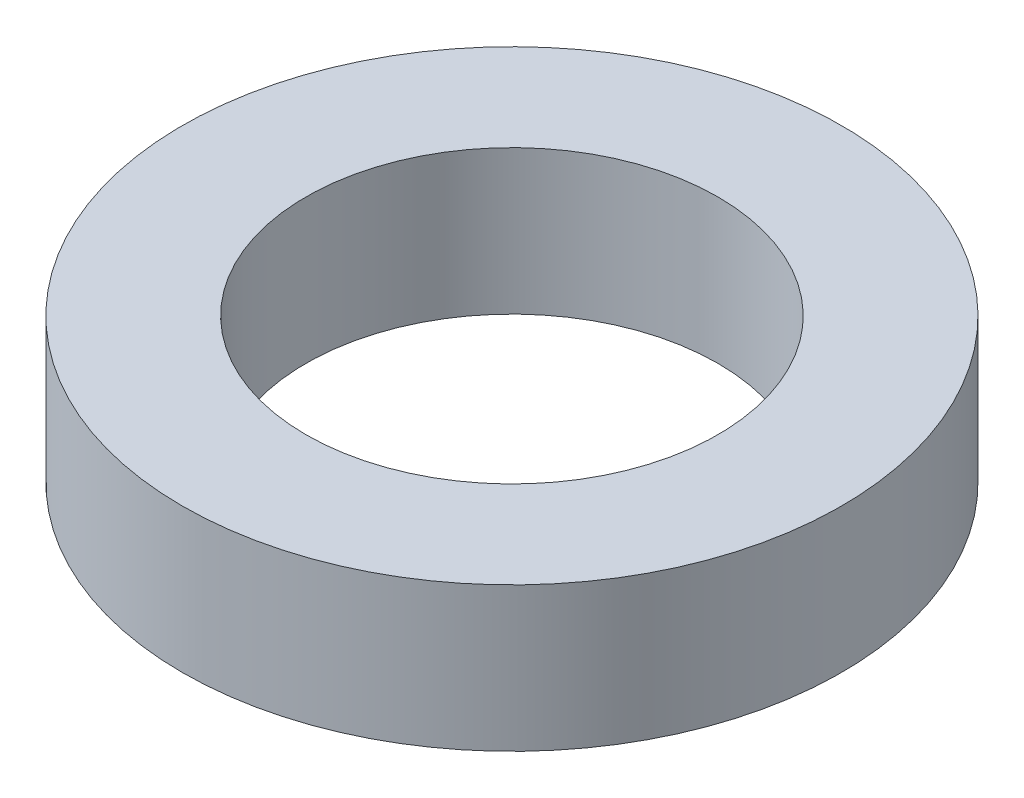
ISO-10303-21;
HEADER;
FILE_DESCRIPTION(('STEP AP214'),'2;1');
FILE_NAME('part.step','',(''),(''),'','','');
FILE_SCHEMA(('AUTOMOTIVE_DESIGN { 1 0 10303 214 1 1 1 1 }'));
ENDSEC;
DATA;
#1=APPLICATION_CONTEXT('core data for automotive mechanical design processes');
#2=APPLICATION_PROTOCOL_DEFINITION('international standard','automotive_design',2000,#1);
#3=PRODUCT_CONTEXT('',#1,'mechanical');
#4=PRODUCT('Part','Part','',(#3));
#5=PRODUCT_RELATED_PRODUCT_CATEGORY('part','',(#4));
#6=PRODUCT_DEFINITION_FORMATION('','',#4);
#7=PRODUCT_DEFINITION_CONTEXT('part definition',#1,'design');
#8=PRODUCT_DEFINITION('design','',#6,#7);
#9=PRODUCT_DEFINITION_SHAPE('','',#8);
#10=(LENGTH_UNIT() NAMED_UNIT(*) SI_UNIT(.MILLI.,.METRE.));
#11=(NAMED_UNIT(*) PLANE_ANGLE_UNIT() SI_UNIT($,.RADIAN.));
#12=(NAMED_UNIT(*) SI_UNIT($,.STERADIAN.) SOLID_ANGLE_UNIT());
#13=UNCERTAINTY_MEASURE_WITH_UNIT(LENGTH_MEASURE(1.E-05),#10,'distance_accuracy_value','');
#14=(GEOMETRIC_REPRESENTATION_CONTEXT(3) GLOBAL_UNCERTAINTY_ASSIGNED_CONTEXT((#13)) GLOBAL_UNIT_ASSIGNED_CONTEXT((#10,
#11,#12)) REPRESENTATION_CONTEXT('',''));
#15=CARTESIAN_POINT('',(0.,0.,0.));
#16=DIRECTION('',(0.,0.,1.));
#17=DIRECTION('',(1.,0.,0.));
#18=AXIS2_PLACEMENT_3D('',#15,#16,#17);
#19=CARTESIAN_POINT('',(0.,3.5,0.));
#20=DIRECTION('',(0.,1.,0.));
#21=DIRECTION('',(0.,0.,1.));
#22=AXIS2_PLACEMENT_3D('',#19,#20,#21);
#23=PLANE('',#22);
#24=CARTESIAN_POINT('',(0.,3.5,0.));
#25=DIRECTION('',(0.,1.,0.));
#26=DIRECTION('',(0.,0.,1.));
#27=AXIS2_PLACEMENT_3D('',#24,#25,#26);
#28=CIRCLE('',#27,16.);
#29=CARTESIAN_POINT('',(0.,3.5,16.));
#30=VERTEX_POINT('',#29);
#31=EDGE_CURVE('E10',#30,#30,#28,.T.);
#32=ORIENTED_EDGE('',*,*,#31,.T.);
#33=EDGE_LOOP('',(#32));
#34=FACE_BOUND('',#33,.T.);
#35=CARTESIAN_POINT('',(0.,3.5,0.));
#36=DIRECTION('',(0.,1.,0.));
#37=DIRECTION('',(0.,0.,1.));
#38=AXIS2_PLACEMENT_3D('',#35,#36,#37);
#39=CIRCLE('',#38,10.);
#40=CARTESIAN_POINT('',(0.,3.5,10.));
#41=VERTEX_POINT('',#40);
#42=EDGE_CURVE('E55',#41,#41,#39,.T.);
#43=ORIENTED_EDGE('',*,*,#42,.F.);
#44=EDGE_LOOP('',(#43));
#45=FACE_BOUND('',#44,.T.);
#46=ADVANCED_FACE('F41',(#34,#45),#23,.T.);
#47=CARTESIAN_POINT('',(0.,-3.5,0.));
#48=DIRECTION('',(0.,1.,0.));
#49=DIRECTION('',(0.,0.,1.));
#50=AXIS2_PLACEMENT_3D('',#47,#48,#49);
#51=PLANE('',#50);
#52=CARTESIAN_POINT('',(0.,-3.5,0.));
#53=DIRECTION('',(0.,1.,0.));
#54=DIRECTION('',(0.,0.,1.));
#55=AXIS2_PLACEMENT_3D('',#52,#53,#54);
#56=CIRCLE('',#55,16.);
#57=CARTESIAN_POINT('',(0.,-3.5,16.));
#58=VERTEX_POINT('',#57);
#59=EDGE_CURVE('E44',#58,#58,#56,.T.);
#60=ORIENTED_EDGE('',*,*,#59,.F.);
#61=EDGE_LOOP('',(#60));
#62=FACE_BOUND('',#61,.T.);
#63=CARTESIAN_POINT('',(0.,-3.5,0.));
#64=DIRECTION('',(0.,1.,0.));
#65=DIRECTION('',(0.,0.,1.));
#66=AXIS2_PLACEMENT_3D('',#63,#64,#65);
#67=CIRCLE('',#66,10.);
#68=CARTESIAN_POINT('',(0.,-3.5,10.));
#69=VERTEX_POINT('',#68);
#70=EDGE_CURVE('E53',#69,#69,#67,.T.);
#71=ORIENTED_EDGE('',*,*,#70,.T.);
#72=EDGE_LOOP('',(#71));
#73=FACE_BOUND('',#72,.T.);
#74=ADVANCED_FACE('F64',(#62,#73),#51,.F.);
#75=CARTESIAN_POINT('',(0.,3.5,0.));
#76=DIRECTION('',(0.,-1.,0.));
#77=DIRECTION('',(0.,0.,-1.));
#78=AXIS2_PLACEMENT_3D('',#75,#76,#77);
#79=CYLINDRICAL_SURFACE('',#78,16.);
#80=ORIENTED_EDGE('',*,*,#31,.F.);
#81=EDGE_LOOP('',(#80));
#82=FACE_BOUND('',#81,.T.);
#83=ORIENTED_EDGE('',*,*,#59,.T.);
#84=EDGE_LOOP('',(#83));
#85=FACE_BOUND('',#84,.T.);
#86=ADVANCED_FACE('F43',(#82,#85),#79,.T.);
#87=CARTESIAN_POINT('',(0.,3.5,0.));
#88=DIRECTION('',(0.,-1.,0.));
#89=DIRECTION('',(0.,0.,-1.));
#90=AXIS2_PLACEMENT_3D('',#87,#88,#89);
#91=CYLINDRICAL_SURFACE('',#90,10.);
#92=ORIENTED_EDGE('',*,*,#42,.T.);
#93=EDGE_LOOP('',(#92));
#94=FACE_BOUND('',#93,.T.);
#95=ORIENTED_EDGE('',*,*,#70,.F.);
#96=EDGE_LOOP('',(#95));
#97=FACE_BOUND('',#96,.T.);
#98=ADVANCED_FACE('F58',(#94,#97),#91,.F.);
#99=CLOSED_SHELL('',(#46,#74,#86,#98));
#100=MANIFOLD_SOLID_BREP('B2',#99);
#101=ADVANCED_BREP_SHAPE_REPRESENTATION('',(#18,#100),#14);
#102=SHAPE_DEFINITION_REPRESENTATION(#9,#101);
ENDSEC;
END-ISO-10303-21;
